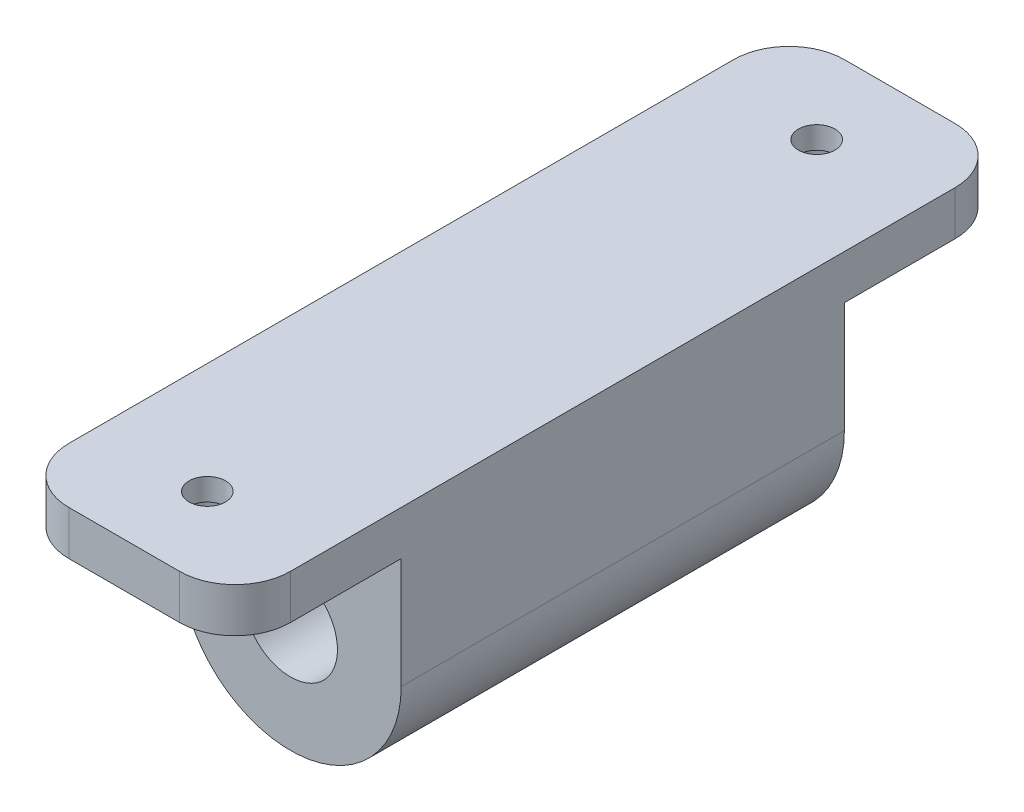
ISO-10303-21;
HEADER;
FILE_DESCRIPTION(('STEP AP214'),'2;1');
FILE_NAME('part.step','',(''),(''),'','','');
FILE_SCHEMA(('AUTOMOTIVE_DESIGN { 1 0 10303 214 1 1 1 1 }'));
ENDSEC;
DATA;
#1=APPLICATION_CONTEXT('core data for automotive mechanical design processes');
#2=APPLICATION_PROTOCOL_DEFINITION('international standard','automotive_design',2000,#1);
#3=PRODUCT_CONTEXT('',#1,'mechanical');
#4=PRODUCT('Part','Part','',(#3));
#5=PRODUCT_RELATED_PRODUCT_CATEGORY('part','',(#4));
#6=PRODUCT_DEFINITION_FORMATION('','',#4);
#7=PRODUCT_DEFINITION_CONTEXT('part definition',#1,'design');
#8=PRODUCT_DEFINITION('design','',#6,#7);
#9=PRODUCT_DEFINITION_SHAPE('','',#8);
#10=(LENGTH_UNIT() NAMED_UNIT(*) SI_UNIT(.MILLI.,.METRE.));
#11=(NAMED_UNIT(*) PLANE_ANGLE_UNIT() SI_UNIT($,.RADIAN.));
#12=(NAMED_UNIT(*) SI_UNIT($,.STERADIAN.) SOLID_ANGLE_UNIT());
#13=UNCERTAINTY_MEASURE_WITH_UNIT(LENGTH_MEASURE(1.E-05),#10,'distance_accuracy_value','');
#14=(GEOMETRIC_REPRESENTATION_CONTEXT(3) GLOBAL_UNCERTAINTY_ASSIGNED_CONTEXT((#13)) GLOBAL_UNIT_ASSIGNED_CONTEXT((#10,
#11,#12)) REPRESENTATION_CONTEXT('',''));
#15=CARTESIAN_POINT('',(0.,0.,0.));
#16=DIRECTION('',(0.,0.,1.));
#17=DIRECTION('',(1.,0.,0.));
#18=AXIS2_PLACEMENT_3D('',#15,#16,#17);
#19=CARTESIAN_POINT('',(25.,32.,248.5));
#20=DIRECTION('',(0.,1.,0.));
#21=DIRECTION('',(0.,0.,1.));
#22=AXIS2_PLACEMENT_3D('',#19,#20,#21);
#23=CYLINDRICAL_SURFACE('',#22,1.65);
#24=CARTESIAN_POINT('',(25.,36.,248.5));
#25=DIRECTION('',(0.,-1.,0.));
#26=DIRECTION('',(1.,0.,0.));
#27=AXIS2_PLACEMENT_3D('',#24,#25,#26);
#28=CIRCLE('',#27,1.65);
#29=CARTESIAN_POINT('',(26.65,36.,248.5));
#30=VERTEX_POINT('',#29);
#31=EDGE_CURVE('E186',#30,#30,#28,.T.);
#32=ORIENTED_EDGE('',*,*,#31,.F.);
#33=EDGE_LOOP('',(#32));
#34=FACE_BOUND('',#33,.T.);
#35=CARTESIAN_POINT('',(25.,34.,248.5));
#36=DIRECTION('',(0.,-1.,0.));
#37=DIRECTION('',(0.,0.,-1.));
#38=AXIS2_PLACEMENT_3D('',#35,#36,#37);
#39=CIRCLE('',#38,1.65);
#40=CARTESIAN_POINT('',(25.,34.,246.85));
#41=VERTEX_POINT('',#40);
#42=EDGE_CURVE('E20',#41,#41,#39,.T.);
#43=ORIENTED_EDGE('',*,*,#42,.T.);
#44=EDGE_LOOP('',(#43));
#45=FACE_BOUND('',#44,.T.);
#46=ADVANCED_FACE('F16',(#34,#45),#23,.F.);
#47=CARTESIAN_POINT('',(25.,32.,193.5));
#48=DIRECTION('',(0.,1.,0.));
#49=DIRECTION('',(0.,0.,1.));
#50=AXIS2_PLACEMENT_3D('',#47,#48,#49);
#51=CYLINDRICAL_SURFACE('',#50,1.65);
#52=CARTESIAN_POINT('',(25.,36.,193.5));
#53=DIRECTION('',(0.,-1.,0.));
#54=DIRECTION('',(1.,0.,0.));
#55=AXIS2_PLACEMENT_3D('',#52,#53,#54);
#56=CIRCLE('',#55,1.65);
#57=CARTESIAN_POINT('',(26.65,36.,193.5));
#58=VERTEX_POINT('',#57);
#59=EDGE_CURVE('E213',#58,#58,#56,.T.);
#60=ORIENTED_EDGE('',*,*,#59,.F.);
#61=EDGE_LOOP('',(#60));
#62=FACE_BOUND('',#61,.T.);
#63=CARTESIAN_POINT('',(25.,34.,193.5));
#64=DIRECTION('',(0.,-1.,0.));
#65=DIRECTION('',(0.,0.,-1.));
#66=AXIS2_PLACEMENT_3D('',#63,#64,#65);
#67=CIRCLE('',#66,1.65);
#68=CARTESIAN_POINT('',(25.,34.,191.85));
#69=VERTEX_POINT('',#68);
#70=EDGE_CURVE('E277',#69,#69,#67,.T.);
#71=ORIENTED_EDGE('',*,*,#70,.T.);
#72=EDGE_LOOP('',(#71));
#73=FACE_BOUND('',#72,.T.);
#74=ADVANCED_FACE('F329',(#62,#73),#51,.F.);
#75=CARTESIAN_POINT('',(0.,32.,230.));
#76=DIRECTION('',(0.,-1.,0.));
#77=DIRECTION('',(1.,0.,0.));
#78=AXIS2_PLACEMENT_3D('',#75,#76,#77);
#79=PLANE('',#78);
#80=CARTESIAN_POINT('',(25.,32.,248.5));
#81=DIRECTION('',(0.,-1.,0.));
#82=DIRECTION('',(1.,0.,0.));
#83=AXIS2_PLACEMENT_3D('',#80,#81,#82);
#84=CIRCLE('',#83,3.);
#85=CARTESIAN_POINT('',(28.,32.,248.5));
#86=VERTEX_POINT('',#85);
#87=EDGE_CURVE('E289',#86,#86,#84,.T.);
#88=ORIENTED_EDGE('',*,*,#87,.F.);
#89=EDGE_LOOP('',(#88));
#90=FACE_BOUND('',#89,.T.);
#91=DIRECTION('',(0.,0.,-1.));
#92=VECTOR('',#91,1.);
#93=CARTESIAN_POINT('',(35.,32.,218.));
#94=LINE('',#93,#92);
#95=CARTESIAN_POINT('',(35.,32.,251.));
#96=VERTEX_POINT('',#95);
#97=CARTESIAN_POINT('',(35.,32.,241.));
#98=VERTEX_POINT('',#97);
#99=EDGE_CURVE('E159',#96,#98,#94,.T.);
#100=ORIENTED_EDGE('',*,*,#99,.F.);
#101=CARTESIAN_POINT('',(30.,32.,251.));
#102=DIRECTION('',(0.,-1.,0.));
#103=DIRECTION('',(0.,0.,-1.));
#104=AXIS2_PLACEMENT_3D('',#101,#102,#103);
#105=CIRCLE('',#104,5.);
#106=CARTESIAN_POINT('',(30.,32.,256.));
#107=VERTEX_POINT('',#106);
#108=EDGE_CURVE('E260',#96,#107,#105,.T.);
#109=ORIENTED_EDGE('',*,*,#108,.T.);
#110=DIRECTION('',(-1.,0.,0.));
#111=VECTOR('',#110,1.);
#112=CARTESIAN_POINT('',(24.9827166832982,32.,256.));
#113=LINE('',#112,#111);
#114=CARTESIAN_POINT('',(20.,32.,256.));
#115=VERTEX_POINT('',#114);
#116=EDGE_CURVE('E191',#107,#115,#113,.T.);
#117=ORIENTED_EDGE('',*,*,#116,.T.);
#118=CARTESIAN_POINT('',(20.,32.,251.));
#119=DIRECTION('',(0.,-1.,0.));
#120=DIRECTION('',(0.,0.,-1.));
#121=AXIS2_PLACEMENT_3D('',#118,#119,#120);
#122=CIRCLE('',#121,5.);
#123=CARTESIAN_POINT('',(15.,32.,251.));
#124=VERTEX_POINT('',#123);
#125=EDGE_CURVE('E257',#115,#124,#122,.T.);
#126=ORIENTED_EDGE('',*,*,#125,.T.);
#127=DIRECTION('',(0.,0.,1.));
#128=VECTOR('',#127,1.);
#129=CARTESIAN_POINT('',(15.,32.,222.730658948422));
#130=LINE('',#129,#128);
#131=CARTESIAN_POINT('',(15.,32.,241.));
#132=VERTEX_POINT('',#131);
#133=EDGE_CURVE('E188',#132,#124,#130,.T.);
#134=ORIENTED_EDGE('',*,*,#133,.F.);
#135=DIRECTION('',(1.,0.,0.));
#136=VECTOR('',#135,1.);
#137=CARTESIAN_POINT('',(24.9827166832982,32.,241.));
#138=LINE('',#137,#136);
#139=EDGE_CURVE('E166',#132,#98,#138,.T.);
#140=ORIENTED_EDGE('',*,*,#139,.T.);
#141=EDGE_LOOP('',(#100,#109,#117,#126,#134,#140));
#142=FACE_BOUND('',#141,.T.);
#143=ADVANCED_FACE('F316',(#90,#142),#79,.T.);
#144=CARTESIAN_POINT('',(15.,32.,222.730658948422));
#145=DIRECTION('',(-1.,0.,0.));
#146=DIRECTION('',(0.,0.,1.));
#147=AXIS2_PLACEMENT_3D('',#144,#145,#146);
#148=PLANE('',#147);
#149=ORIENTED_EDGE('',*,*,#133,.T.);
#150=DIRECTION('',(0.,1.,0.));
#151=VECTOR('',#150,1.);
#152=CARTESIAN_POINT('',(15.,36.,251.));
#153=LINE('',#152,#151);
#154=CARTESIAN_POINT('',(15.,36.,251.));
#155=VERTEX_POINT('',#154);
#156=EDGE_CURVE('E266',#124,#155,#153,.T.);
#157=ORIENTED_EDGE('',*,*,#156,.T.);
#158=DIRECTION('',(0.,0.,1.));
#159=VECTOR('',#158,1.);
#160=CARTESIAN_POINT('',(15.,36.,222.730658948422));
#161=LINE('',#160,#159);
#162=CARTESIAN_POINT('',(15.,36.,191.));
#163=VERTEX_POINT('',#162);
#164=EDGE_CURVE('E201',#163,#155,#161,.T.);
#165=ORIENTED_EDGE('',*,*,#164,.F.);
#166=DIRECTION('',(0.,1.,0.));
#167=VECTOR('',#166,1.);
#168=CARTESIAN_POINT('',(15.,32.,191.));
#169=LINE('',#168,#167);
#170=CARTESIAN_POINT('',(15.,32.,191.));
#171=VERTEX_POINT('',#170);
#172=EDGE_CURVE('E263',#163,#171,#169,.F.);
#173=ORIENTED_EDGE('',*,*,#172,.T.);
#174=CARTESIAN_POINT('',(15.,32.,201.));
#175=VERTEX_POINT('',#174);
#176=EDGE_CURVE('E160',#171,#175,#130,.T.);
#177=ORIENTED_EDGE('',*,*,#176,.T.);
#178=DIRECTION('',(0.,1.,0.));
#179=VECTOR('',#178,1.);
#180=CARTESIAN_POINT('',(15.,12.,201.));
#181=LINE('',#180,#179);
#182=CARTESIAN_POINT('',(15.,22.,201.));
#183=VERTEX_POINT('',#182);
#184=EDGE_CURVE('E151',#183,#175,#181,.T.);
#185=ORIENTED_EDGE('',*,*,#184,.F.);
#186=DIRECTION('',(0.,0.,1.));
#187=VECTOR('',#186,1.);
#188=CARTESIAN_POINT('',(15.,22.,222.730658948422));
#189=LINE('',#188,#187);
#190=CARTESIAN_POINT('',(15.,22.,241.));
#191=VERTEX_POINT('',#190);
#192=EDGE_CURVE('E229',#183,#191,#189,.T.);
#193=ORIENTED_EDGE('',*,*,#192,.T.);
#194=DIRECTION('',(0.,1.,0.));
#195=VECTOR('',#194,1.);
#196=CARTESIAN_POINT('',(15.,12.,241.));
#197=LINE('',#196,#195);
#198=EDGE_CURVE('E172',#191,#132,#197,.T.);
#199=ORIENTED_EDGE('',*,*,#198,.T.);
#200=EDGE_LOOP('',(#149,#157,#165,#173,#177,#185,#193,#199));
#201=FACE_BOUND('',#200,.T.);
#202=ADVANCED_FACE('F328',(#201),#148,.T.);
#203=CARTESIAN_POINT('',(24.9827166832982,32.,186.));
#204=DIRECTION('',(0.,0.,-1.));
#205=DIRECTION('',(-1.,0.,0.));
#206=AXIS2_PLACEMENT_3D('',#203,#204,#205);
#207=PLANE('',#206);
#208=DIRECTION('',(-1.,0.,0.));
#209=VECTOR('',#208,1.);
#210=CARTESIAN_POINT('',(24.9827166832982,32.,186.));
#211=LINE('',#210,#209);
#212=CARTESIAN_POINT('',(30.,32.,186.));
#213=VERTEX_POINT('',#212);
#214=CARTESIAN_POINT('',(20.,32.,186.));
#215=VERTEX_POINT('',#214);
#216=EDGE_CURVE('E195',#213,#215,#211,.T.);
#217=ORIENTED_EDGE('',*,*,#216,.T.);
#218=DIRECTION('',(0.,1.,0.));
#219=VECTOR('',#218,1.);
#220=CARTESIAN_POINT('',(20.,32.,186.));
#221=LINE('',#220,#219);
#222=CARTESIAN_POINT('',(20.,36.,186.));
#223=VERTEX_POINT('',#222);
#224=EDGE_CURVE('E272',#215,#223,#221,.T.);
#225=ORIENTED_EDGE('',*,*,#224,.T.);
#226=DIRECTION('',(-1.,0.,0.));
#227=VECTOR('',#226,1.);
#228=CARTESIAN_POINT('',(24.9827166832982,36.,186.));
#229=LINE('',#228,#227);
#230=CARTESIAN_POINT('',(30.,36.,186.));
#231=VERTEX_POINT('',#230);
#232=EDGE_CURVE('E217',#231,#223,#229,.T.);
#233=ORIENTED_EDGE('',*,*,#232,.F.);
#234=DIRECTION('',(0.,1.,0.));
#235=VECTOR('',#234,1.);
#236=CARTESIAN_POINT('',(30.,32.,186.));
#237=LINE('',#236,#235);
#238=EDGE_CURVE('E48',#231,#213,#237,.F.);
#239=ORIENTED_EDGE('',*,*,#238,.T.);
#240=EDGE_LOOP('',(#217,#225,#233,#239));
#241=FACE_BOUND('',#240,.T.);
#242=ADVANCED_FACE('F365',(#241),#207,.T.);
#243=CARTESIAN_POINT('',(35.,32.,218.));
#244=DIRECTION('',(1.,0.,0.));
#245=DIRECTION('',(0.,0.,-1.));
#246=AXIS2_PLACEMENT_3D('',#243,#244,#245);
#247=PLANE('',#246);
#248=DIRECTION('',(0.,0.,-1.));
#249=VECTOR('',#248,1.);
#250=CARTESIAN_POINT('',(35.,36.,218.));
#251=LINE('',#250,#249);
#252=CARTESIAN_POINT('',(35.,36.,251.));
#253=VERTEX_POINT('',#252);
#254=CARTESIAN_POINT('',(35.,36.,191.));
#255=VERTEX_POINT('',#254);
#256=EDGE_CURVE('E205',#253,#255,#251,.T.);
#257=ORIENTED_EDGE('',*,*,#256,.F.);
#258=DIRECTION('',(0.,1.,0.));
#259=VECTOR('',#258,1.);
#260=CARTESIAN_POINT('',(35.,32.,251.));
#261=LINE('',#260,#259);
#262=EDGE_CURVE('E254',#253,#96,#261,.F.);
#263=ORIENTED_EDGE('',*,*,#262,.T.);
#264=ORIENTED_EDGE('',*,*,#99,.T.);
#265=DIRECTION('',(0.,1.,0.));
#266=VECTOR('',#265,1.);
#267=CARTESIAN_POINT('',(35.,12.,241.));
#268=LINE('',#267,#266);
#269=CARTESIAN_POINT('',(35.,22.,241.));
#270=VERTEX_POINT('',#269);
#271=EDGE_CURVE('E152',#270,#98,#268,.T.);
#272=ORIENTED_EDGE('',*,*,#271,.F.);
#273=DIRECTION('',(0.,0.,-1.));
#274=VECTOR('',#273,1.);
#275=CARTESIAN_POINT('',(35.,22.,218.));
#276=LINE('',#275,#274);
#277=CARTESIAN_POINT('',(35.,22.,201.));
#278=VERTEX_POINT('',#277);
#279=EDGE_CURVE('E147',#270,#278,#276,.T.);
#280=ORIENTED_EDGE('',*,*,#279,.T.);
#281=DIRECTION('',(0.,1.,0.));
#282=VECTOR('',#281,1.);
#283=CARTESIAN_POINT('',(35.,12.,201.));
#284=LINE('',#283,#282);
#285=CARTESIAN_POINT('',(35.,32.,201.));
#286=VERTEX_POINT('',#285);
#287=EDGE_CURVE('E138',#278,#286,#284,.T.);
#288=ORIENTED_EDGE('',*,*,#287,.T.);
#289=CARTESIAN_POINT('',(35.,32.,191.));
#290=VERTEX_POINT('',#289);
#291=EDGE_CURVE('E143',#286,#290,#94,.T.);
#292=ORIENTED_EDGE('',*,*,#291,.T.);
#293=DIRECTION('',(0.,1.,0.));
#294=VECTOR('',#293,1.);
#295=CARTESIAN_POINT('',(35.,32.,191.));
#296=LINE('',#295,#294);
#297=EDGE_CURVE('E251',#290,#255,#296,.T.);
#298=ORIENTED_EDGE('',*,*,#297,.T.);
#299=EDGE_LOOP('',(#257,#263,#264,#272,#280,#288,#292,#298));
#300=FACE_BOUND('',#299,.T.);
#301=ADVANCED_FACE('F141',(#300),#247,.T.);
#302=CARTESIAN_POINT('',(24.9827166832982,32.,256.));
#303=DIRECTION('',(0.,0.,-1.));
#304=DIRECTION('',(-1.,0.,0.));
#305=AXIS2_PLACEMENT_3D('',#302,#303,#304);
#306=PLANE('',#305);
#307=ORIENTED_EDGE('',*,*,#116,.F.);
#308=DIRECTION('',(0.,1.,0.));
#309=VECTOR('',#308,1.);
#310=CARTESIAN_POINT('',(30.,36.,256.));
#311=LINE('',#310,#309);
#312=CARTESIAN_POINT('',(30.,36.,256.));
#313=VERTEX_POINT('',#312);
#314=EDGE_CURVE('E235',#107,#313,#311,.T.);
#315=ORIENTED_EDGE('',*,*,#314,.T.);
#316=DIRECTION('',(-1.,0.,0.));
#317=VECTOR('',#316,1.);
#318=CARTESIAN_POINT('',(24.9827166832982,36.,256.));
#319=LINE('',#318,#317);
#320=CARTESIAN_POINT('',(20.,36.,256.));
#321=VERTEX_POINT('',#320);
#322=EDGE_CURVE('E209',#313,#321,#319,.T.);
#323=ORIENTED_EDGE('',*,*,#322,.T.);
#324=DIRECTION('',(0.,1.,0.));
#325=VECTOR('',#324,1.);
#326=CARTESIAN_POINT('',(20.,32.,256.));
#327=LINE('',#326,#325);
#328=EDGE_CURVE('E232',#321,#115,#327,.F.);
#329=ORIENTED_EDGE('',*,*,#328,.T.);
#330=EDGE_LOOP('',(#307,#315,#323,#329));
#331=FACE_BOUND('',#330,.T.);
#332=ADVANCED_FACE('F314',(#331),#306,.F.);
#333=CARTESIAN_POINT('',(25.,32.,193.5));
#334=DIRECTION('',(0.,-1.,0.));
#335=DIRECTION('',(1.,0.,0.));
#336=AXIS2_PLACEMENT_3D('',#333,#334,#335);
#337=CIRCLE('',#336,3.);
#338=CARTESIAN_POINT('',(28.,32.,193.5));
#339=VERTEX_POINT('',#338);
#340=EDGE_CURVE('E303',#339,#339,#337,.T.);
#341=ORIENTED_EDGE('',*,*,#340,.F.);
#342=EDGE_LOOP('',(#341));
#343=FACE_BOUND('',#342,.T.);
#344=ORIENTED_EDGE('',*,*,#176,.F.);
#345=CARTESIAN_POINT('',(20.,32.,191.));
#346=DIRECTION('',(0.,-1.,0.));
#347=DIRECTION('',(0.,0.,-1.));
#348=AXIS2_PLACEMENT_3D('',#345,#346,#347);
#349=CIRCLE('',#348,5.);
#350=EDGE_CURVE('E10',#171,#215,#349,.T.);
#351=ORIENTED_EDGE('',*,*,#350,.T.);
#352=ORIENTED_EDGE('',*,*,#216,.F.);
#353=CARTESIAN_POINT('',(30.,32.,191.));
#354=DIRECTION('',(0.,-1.,0.));
#355=DIRECTION('',(0.,0.,-1.));
#356=AXIS2_PLACEMENT_3D('',#353,#354,#355);
#357=CIRCLE('',#356,5.);
#358=EDGE_CURVE('E26',#213,#290,#357,.T.);
#359=ORIENTED_EDGE('',*,*,#358,.T.);
#360=ORIENTED_EDGE('',*,*,#291,.F.);
#361=DIRECTION('',(1.,0.,0.));
#362=VECTOR('',#361,1.);
#363=CARTESIAN_POINT('',(24.9827166832982,32.,201.));
#364=LINE('',#363,#362);
#365=EDGE_CURVE('E156',#175,#286,#364,.T.);
#366=ORIENTED_EDGE('',*,*,#365,.F.);
#367=EDGE_LOOP('',(#344,#351,#352,#359,#360,#366));
#368=FACE_BOUND('',#367,.T.);
#369=ADVANCED_FACE('F155',(#343,#368),#79,.T.);
#370=CARTESIAN_POINT('',(0.,36.,230.));
#371=DIRECTION('',(0.,-1.,0.));
#372=DIRECTION('',(1.,0.,0.));
#373=AXIS2_PLACEMENT_3D('',#370,#371,#372);
#374=PLANE('',#373);
#375=ORIENTED_EDGE('',*,*,#31,.T.);
#376=EDGE_LOOP('',(#375));
#377=FACE_BOUND('',#376,.T.);
#378=ORIENTED_EDGE('',*,*,#322,.F.);
#379=CARTESIAN_POINT('',(30.,36.,251.));
#380=DIRECTION('',(0.,-1.,0.));
#381=DIRECTION('',(0.,0.,-1.));
#382=AXIS2_PLACEMENT_3D('',#379,#380,#381);
#383=CIRCLE('',#382,5.);
#384=EDGE_CURVE('E248',#313,#253,#383,.F.);
#385=ORIENTED_EDGE('',*,*,#384,.T.);
#386=ORIENTED_EDGE('',*,*,#256,.T.);
#387=CARTESIAN_POINT('',(30.,36.,191.));
#388=DIRECTION('',(0.,-1.,0.));
#389=DIRECTION('',(0.,0.,-1.));
#390=AXIS2_PLACEMENT_3D('',#387,#388,#389);
#391=CIRCLE('',#390,5.);
#392=EDGE_CURVE('E239',#255,#231,#391,.F.);
#393=ORIENTED_EDGE('',*,*,#392,.T.);
#394=ORIENTED_EDGE('',*,*,#232,.T.);
#395=CARTESIAN_POINT('',(20.,36.,191.));
#396=DIRECTION('',(0.,-1.,0.));
#397=DIRECTION('',(0.,0.,-1.));
#398=AXIS2_PLACEMENT_3D('',#395,#396,#397);
#399=CIRCLE('',#398,5.);
#400=EDGE_CURVE('E242',#223,#163,#399,.F.);
#401=ORIENTED_EDGE('',*,*,#400,.T.);
#402=ORIENTED_EDGE('',*,*,#164,.T.);
#403=CARTESIAN_POINT('',(20.,36.,251.));
#404=DIRECTION('',(0.,-1.,0.));
#405=DIRECTION('',(0.,0.,-1.));
#406=AXIS2_PLACEMENT_3D('',#403,#404,#405);
#407=CIRCLE('',#406,5.);
#408=EDGE_CURVE('E245',#155,#321,#407,.F.);
#409=ORIENTED_EDGE('',*,*,#408,.T.);
#410=EDGE_LOOP('',(#378,#385,#386,#393,#394,#401,#402,#409));
#411=FACE_BOUND('',#410,.T.);
#412=ORIENTED_EDGE('',*,*,#59,.T.);
#413=EDGE_LOOP('',(#412));
#414=FACE_BOUND('',#413,.T.);
#415=ADVANCED_FACE('F313',(#377,#411,#414),#374,.F.);
#416=CARTESIAN_POINT('',(24.9827166832982,12.,201.));
#417=DIRECTION('',(0.,0.,1.));
#418=DIRECTION('',(1.,0.,0.));
#419=AXIS2_PLACEMENT_3D('',#416,#417,#418);
#420=PLANE('',#419);
#421=CARTESIAN_POINT('',(25.,22.,201.));
#422=DIRECTION('',(0.,0.,1.));
#423=DIRECTION('',(1.,0.,0.));
#424=AXIS2_PLACEMENT_3D('',#421,#422,#423);
#425=CIRCLE('',#424,4.25);
#426=CARTESIAN_POINT('',(29.25,22.,201.));
#427=VERTEX_POINT('',#426);
#428=EDGE_CURVE('E175',#427,#427,#425,.F.);
#429=ORIENTED_EDGE('',*,*,#428,.F.);
#430=EDGE_LOOP('',(#429));
#431=FACE_BOUND('',#430,.T.);
#432=ORIENTED_EDGE('',*,*,#287,.F.);
#433=CARTESIAN_POINT('',(25.,22.,201.));
#434=DIRECTION('',(0.,0.,1.));
#435=DIRECTION('',(1.,0.,0.));
#436=AXIS2_PLACEMENT_3D('',#433,#434,#435);
#437=CIRCLE('',#436,10.);
#438=EDGE_CURVE('E223',#278,#183,#437,.F.);
#439=ORIENTED_EDGE('',*,*,#438,.T.);
#440=ORIENTED_EDGE('',*,*,#184,.T.);
#441=ORIENTED_EDGE('',*,*,#365,.T.);
#442=EDGE_LOOP('',(#432,#439,#440,#441));
#443=FACE_BOUND('',#442,.T.);
#444=ADVANCED_FACE('F163',(#431,#443),#420,.F.);
#445=CARTESIAN_POINT('',(24.9827166832982,12.,241.));
#446=DIRECTION('',(0.,0.,1.));
#447=DIRECTION('',(1.,0.,0.));
#448=AXIS2_PLACEMENT_3D('',#445,#446,#447);
#449=PLANE('',#448);
#450=CARTESIAN_POINT('',(25.,22.,241.));
#451=DIRECTION('',(0.,0.,1.));
#452=DIRECTION('',(1.,0.,0.));
#453=AXIS2_PLACEMENT_3D('',#450,#451,#452);
#454=CIRCLE('',#453,4.25);
#455=CARTESIAN_POINT('',(29.25,22.,241.));
#456=VERTEX_POINT('',#455);
#457=EDGE_CURVE('E167',#456,#456,#454,.T.);
#458=ORIENTED_EDGE('',*,*,#457,.F.);
#459=EDGE_LOOP('',(#458));
#460=FACE_BOUND('',#459,.T.);
#461=CARTESIAN_POINT('',(25.,22.,241.));
#462=DIRECTION('',(0.,0.,1.));
#463=DIRECTION('',(1.,0.,0.));
#464=AXIS2_PLACEMENT_3D('',#461,#462,#463);
#465=CIRCLE('',#464,10.);
#466=EDGE_CURVE('E226',#191,#270,#465,.T.);
#467=ORIENTED_EDGE('',*,*,#466,.T.);
#468=ORIENTED_EDGE('',*,*,#271,.T.);
#469=ORIENTED_EDGE('',*,*,#139,.F.);
#470=ORIENTED_EDGE('',*,*,#198,.F.);
#471=EDGE_LOOP('',(#467,#468,#469,#470));
#472=FACE_BOUND('',#471,.T.);
#473=ADVANCED_FACE('F456',(#460,#472),#449,.T.);
#474=CARTESIAN_POINT('',(25.,22.,185.998));
#475=DIRECTION('',(0.,0.,1.));
#476=DIRECTION('',(1.,0.,0.));
#477=AXIS2_PLACEMENT_3D('',#474,#475,#476);
#478=CYLINDRICAL_SURFACE('',#477,4.25);
#479=ORIENTED_EDGE('',*,*,#428,.T.);
#480=EDGE_LOOP('',(#479));
#481=FACE_BOUND('',#480,.T.);
#482=ORIENTED_EDGE('',*,*,#457,.T.);
#483=EDGE_LOOP('',(#482));
#484=FACE_BOUND('',#483,.T.);
#485=ADVANCED_FACE('F348',(#481,#484),#478,.F.);
#486=CARTESIAN_POINT('',(25.,22.,222.730658948422));
#487=DIRECTION('',(0.,0.,1.));
#488=DIRECTION('',(1.,0.,0.));
#489=AXIS2_PLACEMENT_3D('',#486,#487,#488);
#490=CYLINDRICAL_SURFACE('',#489,10.);
#491=ORIENTED_EDGE('',*,*,#438,.F.);
#492=ORIENTED_EDGE('',*,*,#279,.F.);
#493=ORIENTED_EDGE('',*,*,#466,.F.);
#494=ORIENTED_EDGE('',*,*,#192,.F.);
#495=EDGE_LOOP('',(#491,#492,#493,#494));
#496=FACE_BOUND('',#495,.T.);
#497=ADVANCED_FACE('F344',(#496),#490,.T.);
#498=CARTESIAN_POINT('',(30.,32.,251.));
#499=DIRECTION('',(0.,-1.,0.));
#500=DIRECTION('',(0.,0.,-1.));
#501=AXIS2_PLACEMENT_3D('',#498,#499,#500);
#502=CYLINDRICAL_SURFACE('',#501,5.);
#503=ORIENTED_EDGE('',*,*,#108,.F.);
#504=ORIENTED_EDGE('',*,*,#262,.F.);
#505=ORIENTED_EDGE('',*,*,#384,.F.);
#506=ORIENTED_EDGE('',*,*,#314,.F.);
#507=EDGE_LOOP('',(#503,#504,#505,#506));
#508=FACE_BOUND('',#507,.T.);
#509=ADVANCED_FACE('F347',(#508),#502,.T.);
#510=CARTESIAN_POINT('',(20.,32.,251.));
#511=DIRECTION('',(0.,-1.,0.));
#512=DIRECTION('',(0.,0.,-1.));
#513=AXIS2_PLACEMENT_3D('',#510,#511,#512);
#514=CYLINDRICAL_SURFACE('',#513,5.);
#515=ORIENTED_EDGE('',*,*,#125,.F.);
#516=ORIENTED_EDGE('',*,*,#328,.F.);
#517=ORIENTED_EDGE('',*,*,#408,.F.);
#518=ORIENTED_EDGE('',*,*,#156,.F.);
#519=EDGE_LOOP('',(#515,#516,#517,#518));
#520=FACE_BOUND('',#519,.T.);
#521=ADVANCED_FACE('F352',(#520),#514,.T.);
#522=CARTESIAN_POINT('',(20.,32.,191.));
#523=DIRECTION('',(0.,1.,0.));
#524=DIRECTION('',(0.,0.,1.));
#525=AXIS2_PLACEMENT_3D('',#522,#523,#524);
#526=CYLINDRICAL_SURFACE('',#525,5.);
#527=ORIENTED_EDGE('',*,*,#350,.F.);
#528=ORIENTED_EDGE('',*,*,#172,.F.);
#529=ORIENTED_EDGE('',*,*,#400,.F.);
#530=ORIENTED_EDGE('',*,*,#224,.F.);
#531=EDGE_LOOP('',(#527,#528,#529,#530));
#532=FACE_BOUND('',#531,.T.);
#533=ADVANCED_FACE('F355',(#532),#526,.T.);
#534=CARTESIAN_POINT('',(30.,32.,191.));
#535=DIRECTION('',(0.,1.,0.));
#536=DIRECTION('',(0.,0.,1.));
#537=AXIS2_PLACEMENT_3D('',#534,#535,#536);
#538=CYLINDRICAL_SURFACE('',#537,5.);
#539=ORIENTED_EDGE('',*,*,#358,.F.);
#540=ORIENTED_EDGE('',*,*,#238,.F.);
#541=ORIENTED_EDGE('',*,*,#392,.F.);
#542=ORIENTED_EDGE('',*,*,#297,.F.);
#543=EDGE_LOOP('',(#539,#540,#541,#542));
#544=FACE_BOUND('',#543,.T.);
#545=ADVANCED_FACE('F18',(#544),#538,.T.);
#546=CARTESIAN_POINT('',(25.,34.,193.5));
#547=DIRECTION('',(0.,-1.,0.));
#548=DIRECTION('',(0.,0.,-1.));
#549=AXIS2_PLACEMENT_3D('',#546,#547,#548);
#550=CYLINDRICAL_SURFACE('',#549,3.);
#551=CARTESIAN_POINT('',(25.,34.,193.5));
#552=DIRECTION('',(0.,-1.,0.));
#553=DIRECTION('',(1.,0.,0.));
#554=AXIS2_PLACEMENT_3D('',#551,#552,#553);
#555=CIRCLE('',#554,3.);
#556=CARTESIAN_POINT('',(28.,34.,193.5));
#557=VERTEX_POINT('',#556);
#558=EDGE_CURVE('E297',#557,#557,#555,.T.);
#559=ORIENTED_EDGE('',*,*,#558,.F.);
#560=EDGE_LOOP('',(#559));
#561=FACE_BOUND('',#560,.T.);
#562=ORIENTED_EDGE('',*,*,#340,.T.);
#563=EDGE_LOOP('',(#562));
#564=FACE_BOUND('',#563,.T.);
#565=ADVANCED_FACE('F310',(#561,#564),#550,.F.);
#566=CARTESIAN_POINT('',(-3.50000000000007,34.,223.25));
#567=DIRECTION('',(0.,-1.,0.));
#568=DIRECTION('',(1.,0.,0.));
#569=AXIS2_PLACEMENT_3D('',#566,#567,#568);
#570=PLANE('',#569);
#571=ORIENTED_EDGE('',*,*,#70,.F.);
#572=EDGE_LOOP('',(#571));
#573=FACE_BOUND('',#572,.T.);
#574=ORIENTED_EDGE('',*,*,#558,.T.);
#575=EDGE_LOOP('',(#574));
#576=FACE_BOUND('',#575,.T.);
#577=ADVANCED_FACE('F439',(#573,#576),#570,.T.);
#578=CARTESIAN_POINT('',(25.,34.,248.5));
#579=DIRECTION('',(0.,-1.,0.));
#580=DIRECTION('',(0.,0.,-1.));
#581=AXIS2_PLACEMENT_3D('',#578,#579,#580);
#582=CYLINDRICAL_SURFACE('',#581,3.);
#583=CARTESIAN_POINT('',(25.,34.,248.5));
#584=DIRECTION('',(0.,-1.,0.));
#585=DIRECTION('',(1.,0.,0.));
#586=AXIS2_PLACEMENT_3D('',#583,#584,#585);
#587=CIRCLE('',#586,3.);
#588=CARTESIAN_POINT('',(28.,34.,248.5));
#589=VERTEX_POINT('',#588);
#590=EDGE_CURVE('E280',#589,#589,#587,.T.);
#591=ORIENTED_EDGE('',*,*,#590,.F.);
#592=EDGE_LOOP('',(#591));
#593=FACE_BOUND('',#592,.T.);
#594=ORIENTED_EDGE('',*,*,#87,.T.);
#595=EDGE_LOOP('',(#594));
#596=FACE_BOUND('',#595,.T.);
#597=ADVANCED_FACE('F432',(#593,#596),#582,.F.);
#598=CARTESIAN_POINT('',(-3.50000000000007,34.,223.25));
#599=DIRECTION('',(0.,-1.,0.));
#600=DIRECTION('',(1.,0.,0.));
#601=AXIS2_PLACEMENT_3D('',#598,#599,#600);
#602=PLANE('',#601);
#603=ORIENTED_EDGE('',*,*,#42,.F.);
#604=EDGE_LOOP('',(#603));
#605=FACE_BOUND('',#604,.T.);
#606=ORIENTED_EDGE('',*,*,#590,.T.);
#607=EDGE_LOOP('',(#606));
#608=FACE_BOUND('',#607,.T.);
#609=ADVANCED_FACE('F428',(#605,#608),#602,.T.);
#610=CLOSED_SHELL('',(#46,#74,#143,#202,#242,#301,#332,#369,#415,#444,#473,#485,#497,#509,#521,
#533,#545,#565,#577,#597,#609));
#611=MANIFOLD_SOLID_BREP('B1',#610);
#612=ADVANCED_BREP_SHAPE_REPRESENTATION('',(#18,#611),#14);
#613=SHAPE_DEFINITION_REPRESENTATION(#9,#612);
ENDSEC;
END-ISO-10303-21;
